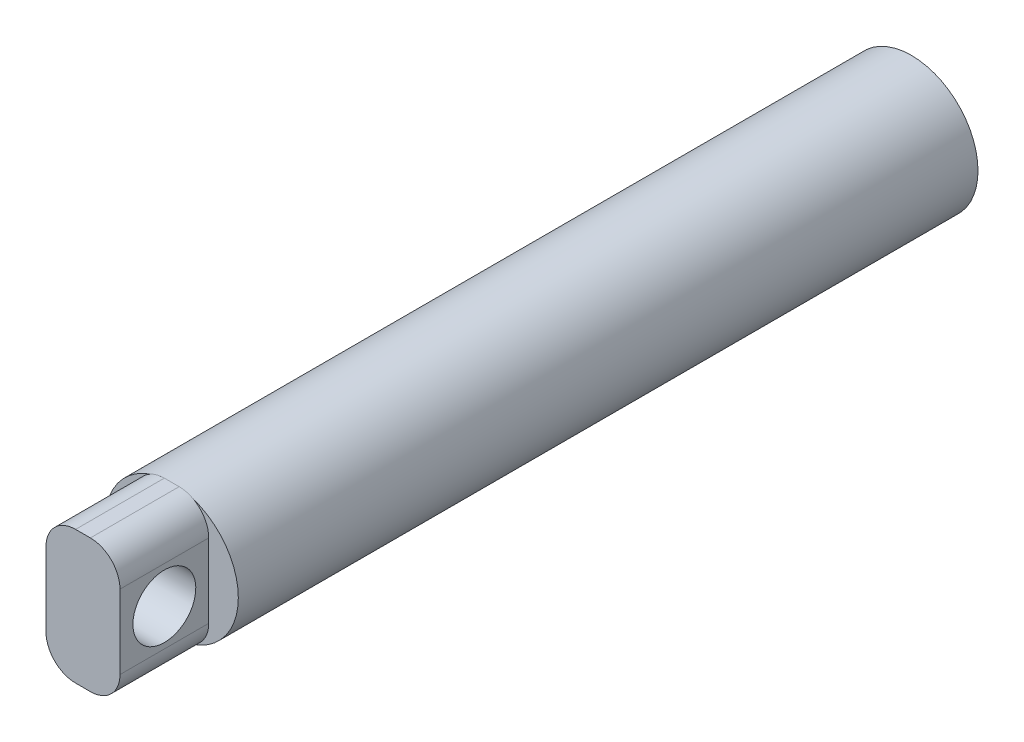
ISO-10303-21;
HEADER;
FILE_DESCRIPTION(('STEP AP214'),'2;1');
FILE_NAME('part.step','',(''),(''),'','','');
FILE_SCHEMA(('AUTOMOTIVE_DESIGN { 1 0 10303 214 1 1 1 1 }'));
ENDSEC;
DATA;
#1=APPLICATION_CONTEXT('core data for automotive mechanical design processes');
#2=APPLICATION_PROTOCOL_DEFINITION('international standard','automotive_design',2000,#1);
#3=PRODUCT_CONTEXT('',#1,'mechanical');
#4=PRODUCT('Part','Part','',(#3));
#5=PRODUCT_RELATED_PRODUCT_CATEGORY('part','',(#4));
#6=PRODUCT_DEFINITION_FORMATION('','',#4);
#7=PRODUCT_DEFINITION_CONTEXT('part definition',#1,'design');
#8=PRODUCT_DEFINITION('design','',#6,#7);
#9=PRODUCT_DEFINITION_SHAPE('','',#8);
#10=(LENGTH_UNIT() NAMED_UNIT(*) SI_UNIT(.MILLI.,.METRE.));
#11=(NAMED_UNIT(*) PLANE_ANGLE_UNIT() SI_UNIT($,.RADIAN.));
#12=(NAMED_UNIT(*) SI_UNIT($,.STERADIAN.) SOLID_ANGLE_UNIT());
#13=UNCERTAINTY_MEASURE_WITH_UNIT(LENGTH_MEASURE(1.E-05),#10,'distance_accuracy_value','');
#14=(GEOMETRIC_REPRESENTATION_CONTEXT(3) GLOBAL_UNCERTAINTY_ASSIGNED_CONTEXT((#13)) GLOBAL_UNIT_ASSIGNED_CONTEXT((#10,
#11,#12)) REPRESENTATION_CONTEXT('',''));
#15=CARTESIAN_POINT('',(0.,0.,0.));
#16=DIRECTION('',(0.,0.,1.));
#17=DIRECTION('',(1.,0.,0.));
#18=AXIS2_PLACEMENT_3D('',#15,#16,#17);
#19=CARTESIAN_POINT('',(0.,0.,50.));
#20=DIRECTION('',(0.,0.,1.));
#21=DIRECTION('',(1.,0.,0.));
#22=AXIS2_PLACEMENT_3D('',#19,#20,#21);
#23=PLANE('',#22);
#24=DIRECTION('',(0.,1.,0.));
#25=VECTOR('',#24,1.);
#26=CARTESIAN_POINT('',(2.5,-4.5,50.));
#27=LINE('',#26,#25);
#28=CARTESIAN_POINT('',(2.5,-2.5,50.));
#29=VERTEX_POINT('',#28);
#30=CARTESIAN_POINT('',(2.5,2.5,50.));
#31=VERTEX_POINT('',#30);
#32=EDGE_CURVE('E143',#29,#31,#27,.T.);
#33=ORIENTED_EDGE('',*,*,#32,.F.);
#34=CARTESIAN_POINT('',(0.5,-2.5,50.));
#35=DIRECTION('',(0.,0.,1.));
#36=DIRECTION('',(1.,0.,0.));
#37=AXIS2_PLACEMENT_3D('',#34,#35,#36);
#38=CIRCLE('',#37,2.);
#39=CARTESIAN_POINT('',(1.44991638187988,-4.26001672362402,50.));
#40=VERTEX_POINT('',#39);
#41=EDGE_CURVE('E110',#29,#40,#38,.F.);
#42=ORIENTED_EDGE('',*,*,#41,.T.);
#43=CARTESIAN_POINT('',(0.,0.,50.));
#44=DIRECTION('',(0.,0.,1.));
#45=DIRECTION('',(1.,0.,0.));
#46=AXIS2_PLACEMENT_3D('',#43,#44,#45);
#47=CIRCLE('',#46,4.5);
#48=CARTESIAN_POINT('',(1.44991638187988,4.26001672362402,50.));
#49=VERTEX_POINT('',#48);
#50=EDGE_CURVE('E61',#40,#49,#47,.T.);
#51=ORIENTED_EDGE('',*,*,#50,.T.);
#52=CARTESIAN_POINT('',(0.500000000000001,2.5,50.));
#53=DIRECTION('',(0.,0.,1.));
#54=DIRECTION('',(1.,0.,0.));
#55=AXIS2_PLACEMENT_3D('',#52,#53,#54);
#56=CIRCLE('',#55,2.);
#57=EDGE_CURVE('E46',#49,#31,#56,.F.);
#58=ORIENTED_EDGE('',*,*,#57,.T.);
#59=EDGE_LOOP('',(#33,#42,#51,#58));
#60=FACE_BOUND('',#59,.T.);
#61=ADVANCED_FACE('F38',(#60),#23,.T.);
#62=CARTESIAN_POINT('',(0.,0.,50.));
#63=DIRECTION('',(0.,0.,-1.));
#64=DIRECTION('',(-1.,0.,0.));
#65=AXIS2_PLACEMENT_3D('',#62,#63,#64);
#66=CYLINDRICAL_SURFACE('',#65,4.5);
#67=CARTESIAN_POINT('',(0.,4.5,50.));
#68=VERTEX_POINT('',#67);
#69=EDGE_CURVE('E193',#49,#68,#47,.T.);
#70=ORIENTED_EDGE('',*,*,#69,.F.);
#71=ORIENTED_EDGE('',*,*,#50,.F.);
#72=CARTESIAN_POINT('',(0.,-4.5,50.));
#73=VERTEX_POINT('',#72);
#74=EDGE_CURVE('E243',#73,#40,#47,.T.);
#75=ORIENTED_EDGE('',*,*,#74,.F.);
#76=CARTESIAN_POINT('',(-1.44991638187988,-4.26001672362402,50.));
#77=VERTEX_POINT('',#76);
#78=EDGE_CURVE('E196',#77,#73,#47,.T.);
#79=ORIENTED_EDGE('',*,*,#78,.F.);
#80=CARTESIAN_POINT('',(-1.44991638187988,4.26001672362402,50.));
#81=VERTEX_POINT('',#80);
#82=EDGE_CURVE('E53',#81,#77,#47,.T.);
#83=ORIENTED_EDGE('',*,*,#82,.F.);
#84=EDGE_CURVE('E107',#68,#81,#47,.T.);
#85=ORIENTED_EDGE('',*,*,#84,.F.);
#86=EDGE_LOOP('',(#70,#71,#75,#79,#83,#85));
#87=FACE_BOUND('',#86,.T.);
#88=CARTESIAN_POINT('',(0.,0.,0.));
#89=DIRECTION('',(0.,0.,1.));
#90=DIRECTION('',(1.,0.,0.));
#91=AXIS2_PLACEMENT_3D('',#88,#89,#90);
#92=CIRCLE('',#91,4.5);
#93=CARTESIAN_POINT('',(4.5,0.,0.));
#94=VERTEX_POINT('',#93);
#95=EDGE_CURVE('E167',#94,#94,#92,.T.);
#96=ORIENTED_EDGE('',*,*,#95,.T.);
#97=EDGE_LOOP('',(#96));
#98=FACE_BOUND('',#97,.T.);
#99=ADVANCED_FACE('F248',(#87,#98),#66,.T.);
#100=DIRECTION('',(0.,-1.,0.));
#101=VECTOR('',#100,1.);
#102=CARTESIAN_POINT('',(-2.5,-4.5,50.));
#103=LINE('',#102,#101);
#104=CARTESIAN_POINT('',(-2.5,2.5,50.));
#105=VERTEX_POINT('',#104);
#106=CARTESIAN_POINT('',(-2.5,-2.5,50.));
#107=VERTEX_POINT('',#106);
#108=EDGE_CURVE('E157',#105,#107,#103,.T.);
#109=ORIENTED_EDGE('',*,*,#108,.F.);
#110=CARTESIAN_POINT('',(-0.5,2.5,50.));
#111=DIRECTION('',(0.,0.,1.));
#112=DIRECTION('',(1.,0.,0.));
#113=AXIS2_PLACEMENT_3D('',#110,#111,#112);
#114=CIRCLE('',#113,2.);
#115=EDGE_CURVE('E11',#105,#81,#114,.F.);
#116=ORIENTED_EDGE('',*,*,#115,.T.);
#117=ORIENTED_EDGE('',*,*,#82,.T.);
#118=CARTESIAN_POINT('',(-0.500000000000001,-2.5,50.));
#119=DIRECTION('',(0.,0.,1.));
#120=DIRECTION('',(1.,0.,0.));
#121=AXIS2_PLACEMENT_3D('',#118,#119,#120);
#122=CIRCLE('',#121,2.);
#123=EDGE_CURVE('E136',#77,#107,#122,.F.);
#124=ORIENTED_EDGE('',*,*,#123,.T.);
#125=EDGE_LOOP('',(#109,#116,#117,#124));
#126=FACE_BOUND('',#125,.T.);
#127=ADVANCED_FACE('F191',(#126),#23,.T.);
#128=CARTESIAN_POINT('',(0.,0.,0.));
#129=DIRECTION('',(0.,0.,1.));
#130=DIRECTION('',(1.,0.,0.));
#131=AXIS2_PLACEMENT_3D('',#128,#129,#130);
#132=PLANE('',#131);
#133=ORIENTED_EDGE('',*,*,#95,.F.);
#134=EDGE_LOOP('',(#133));
#135=FACE_BOUND('',#134,.T.);
#136=ADVANCED_FACE('F270',(#135),#132,.F.);
#137=CARTESIAN_POINT('',(0.,0.,50.));
#138=DIRECTION('',(0.,0.,-1.));
#139=DIRECTION('',(-1.,0.,0.));
#140=AXIS2_PLACEMENT_3D('',#137,#138,#139);
#141=PLANE('',#140);
#142=DIRECTION('',(-1.,0.,0.));
#143=VECTOR('',#142,1.);
#144=CARTESIAN_POINT('',(-2.5,4.5,50.));
#145=LINE('',#144,#143);
#146=CARTESIAN_POINT('',(0.500000000000001,4.5,50.));
#147=VERTEX_POINT('',#146);
#148=EDGE_CURVE('E120',#147,#68,#145,.T.);
#149=ORIENTED_EDGE('',*,*,#148,.F.);
#150=CARTESIAN_POINT('',(0.500000000000001,2.5,50.));
#151=DIRECTION('',(0.,0.,-1.));
#152=DIRECTION('',(-1.,0.,0.));
#153=AXIS2_PLACEMENT_3D('',#150,#151,#152);
#154=CIRCLE('',#153,2.);
#155=EDGE_CURVE('E96',#147,#49,#154,.T.);
#156=ORIENTED_EDGE('',*,*,#155,.T.);
#157=ORIENTED_EDGE('',*,*,#69,.T.);
#158=EDGE_LOOP('',(#149,#156,#157));
#159=FACE_BOUND('',#158,.T.);
#160=ADVANCED_FACE('F274',(#159),#141,.T.);
#161=ORIENTED_EDGE('',*,*,#84,.T.);
#162=CARTESIAN_POINT('',(-0.5,2.5,50.));
#163=DIRECTION('',(0.,0.,-1.));
#164=DIRECTION('',(-1.,0.,0.));
#165=AXIS2_PLACEMENT_3D('',#162,#163,#164);
#166=CIRCLE('',#165,2.);
#167=CARTESIAN_POINT('',(-0.5,4.5,50.));
#168=VERTEX_POINT('',#167);
#169=EDGE_CURVE('E102',#81,#168,#166,.T.);
#170=ORIENTED_EDGE('',*,*,#169,.T.);
#171=EDGE_CURVE('E106',#68,#168,#145,.T.);
#172=ORIENTED_EDGE('',*,*,#171,.F.);
#173=EDGE_LOOP('',(#161,#170,#172));
#174=FACE_BOUND('',#173,.T.);
#175=ADVANCED_FACE('F104',(#174),#141,.T.);
#176=DIRECTION('',(1.,0.,0.));
#177=VECTOR('',#176,1.);
#178=CARTESIAN_POINT('',(-2.5,-4.5,50.));
#179=LINE('',#178,#177);
#180=CARTESIAN_POINT('',(-0.500000000000001,-4.5,50.));
#181=VERTEX_POINT('',#180);
#182=EDGE_CURVE('E198',#181,#73,#179,.T.);
#183=ORIENTED_EDGE('',*,*,#182,.F.);
#184=CARTESIAN_POINT('',(-0.500000000000001,-2.5,50.));
#185=DIRECTION('',(0.,0.,-1.));
#186=DIRECTION('',(-1.,0.,0.));
#187=AXIS2_PLACEMENT_3D('',#184,#185,#186);
#188=CIRCLE('',#187,2.);
#189=EDGE_CURVE('E186',#181,#77,#188,.T.);
#190=ORIENTED_EDGE('',*,*,#189,.T.);
#191=ORIENTED_EDGE('',*,*,#78,.T.);
#192=EDGE_LOOP('',(#183,#190,#191));
#193=FACE_BOUND('',#192,.T.);
#194=ADVANCED_FACE('F246',(#193),#141,.T.);
#195=CARTESIAN_POINT('',(2.5,-4.5,56.));
#196=DIRECTION('',(-1.,0.,0.));
#197=DIRECTION('',(0.,-1.,0.));
#198=AXIS2_PLACEMENT_3D('',#195,#196,#197);
#199=PLANE('',#198);
#200=CARTESIAN_POINT('',(2.5,0.,53.));
#201=DIRECTION('',(-1.,0.,0.));
#202=DIRECTION('',(0.,-1.,0.));
#203=AXIS2_PLACEMENT_3D('',#200,#201,#202);
#204=CIRCLE('',#203,2.125);
#205=CARTESIAN_POINT('',(2.5,-2.125,53.));
#206=VERTEX_POINT('',#205);
#207=EDGE_CURVE('E121',#206,#206,#204,.T.);
#208=ORIENTED_EDGE('',*,*,#207,.T.);
#209=EDGE_LOOP('',(#208));
#210=FACE_BOUND('',#209,.T.);
#211=DIRECTION('',(0.,1.,0.));
#212=VECTOR('',#211,1.);
#213=CARTESIAN_POINT('',(2.5,-4.5,56.));
#214=LINE('',#213,#212);
#215=CARTESIAN_POINT('',(2.5,-2.5,56.));
#216=VERTEX_POINT('',#215);
#217=CARTESIAN_POINT('',(2.5,2.5,56.));
#218=VERTEX_POINT('',#217);
#219=EDGE_CURVE('E200',#216,#218,#214,.T.);
#220=ORIENTED_EDGE('',*,*,#219,.F.);
#221=DIRECTION('',(0.,0.,-1.));
#222=VECTOR('',#221,1.);
#223=CARTESIAN_POINT('',(2.5,-2.5,56.));
#224=LINE('',#223,#222);
#225=EDGE_CURVE('E156',#216,#29,#224,.T.);
#226=ORIENTED_EDGE('',*,*,#225,.T.);
#227=ORIENTED_EDGE('',*,*,#32,.T.);
#228=DIRECTION('',(0.,0.,-1.));
#229=VECTOR('',#228,1.);
#230=CARTESIAN_POINT('',(2.5,2.5,56.));
#231=LINE('',#230,#229);
#232=EDGE_CURVE('E153',#31,#218,#231,.F.);
#233=ORIENTED_EDGE('',*,*,#232,.T.);
#234=EDGE_LOOP('',(#220,#226,#227,#233));
#235=FACE_BOUND('',#234,.T.);
#236=ADVANCED_FACE('F151',(#210,#235),#199,.F.);
#237=CARTESIAN_POINT('',(-2.5,4.5,56.));
#238=DIRECTION('',(0.,-1.,0.));
#239=DIRECTION('',(0.,0.,-1.));
#240=AXIS2_PLACEMENT_3D('',#237,#238,#239);
#241=PLANE('',#240);
#242=DIRECTION('',(-1.,0.,0.));
#243=VECTOR('',#242,1.);
#244=CARTESIAN_POINT('',(-2.5,4.5,56.));
#245=LINE('',#244,#243);
#246=CARTESIAN_POINT('',(0.500000000000001,4.5,56.));
#247=VERTEX_POINT('',#246);
#248=CARTESIAN_POINT('',(-0.5,4.5,56.));
#249=VERTEX_POINT('',#248);
#250=EDGE_CURVE('E206',#247,#249,#245,.T.);
#251=ORIENTED_EDGE('',*,*,#250,.F.);
#252=DIRECTION('',(0.,0.,-1.));
#253=VECTOR('',#252,1.);
#254=CARTESIAN_POINT('',(0.500000000000001,4.5,56.));
#255=LINE('',#254,#253);
#256=EDGE_CURVE('E126',#247,#147,#255,.T.);
#257=ORIENTED_EDGE('',*,*,#256,.T.);
#258=ORIENTED_EDGE('',*,*,#148,.T.);
#259=ORIENTED_EDGE('',*,*,#171,.T.);
#260=DIRECTION('',(0.,0.,-1.));
#261=VECTOR('',#260,1.);
#262=CARTESIAN_POINT('',(-0.5,4.5,56.));
#263=LINE('',#262,#261);
#264=EDGE_CURVE('E117',#168,#249,#263,.F.);
#265=ORIENTED_EDGE('',*,*,#264,.T.);
#266=EDGE_LOOP('',(#251,#257,#258,#259,#265));
#267=FACE_BOUND('',#266,.T.);
#268=ADVANCED_FACE('F116',(#267),#241,.F.);
#269=CARTESIAN_POINT('',(-2.5,-4.5,56.));
#270=DIRECTION('',(1.,0.,0.));
#271=DIRECTION('',(0.,1.,0.));
#272=AXIS2_PLACEMENT_3D('',#269,#270,#271);
#273=PLANE('',#272);
#274=CARTESIAN_POINT('',(-2.5,0.,53.));
#275=DIRECTION('',(-1.,0.,0.));
#276=DIRECTION('',(0.,-1.,0.));
#277=AXIS2_PLACEMENT_3D('',#274,#275,#276);
#278=CIRCLE('',#277,2.125);
#279=CARTESIAN_POINT('',(-2.5,-2.125,53.));
#280=VERTEX_POINT('',#279);
#281=EDGE_CURVE('E367',#280,#280,#278,.T.);
#282=ORIENTED_EDGE('',*,*,#281,.F.);
#283=EDGE_LOOP('',(#282));
#284=FACE_BOUND('',#283,.T.);
#285=ORIENTED_EDGE('',*,*,#108,.T.);
#286=DIRECTION('',(0.,0.,-1.));
#287=VECTOR('',#286,1.);
#288=CARTESIAN_POINT('',(-2.5,-2.5,56.));
#289=LINE('',#288,#287);
#290=CARTESIAN_POINT('',(-2.5,-2.5,56.));
#291=VERTEX_POINT('',#290);
#292=EDGE_CURVE('E83',#107,#291,#289,.F.);
#293=ORIENTED_EDGE('',*,*,#292,.T.);
#294=DIRECTION('',(0.,-1.,0.));
#295=VECTOR('',#294,1.);
#296=CARTESIAN_POINT('',(-2.5,-4.5,56.));
#297=LINE('',#296,#295);
#298=CARTESIAN_POINT('',(-2.5,2.5,56.));
#299=VERTEX_POINT('',#298);
#300=EDGE_CURVE('E190',#299,#291,#297,.T.);
#301=ORIENTED_EDGE('',*,*,#300,.F.);
#302=DIRECTION('',(0.,0.,-1.));
#303=VECTOR('',#302,1.);
#304=CARTESIAN_POINT('',(-2.5,2.5,56.));
#305=LINE('',#304,#303);
#306=EDGE_CURVE('E129',#299,#105,#305,.T.);
#307=ORIENTED_EDGE('',*,*,#306,.T.);
#308=EDGE_LOOP('',(#285,#293,#301,#307));
#309=FACE_BOUND('',#308,.T.);
#310=ADVANCED_FACE('F189',(#284,#309),#273,.F.);
#311=CARTESIAN_POINT('',(-2.5,-4.5,56.));
#312=DIRECTION('',(0.,1.,0.));
#313=DIRECTION('',(0.,0.,1.));
#314=AXIS2_PLACEMENT_3D('',#311,#312,#313);
#315=PLANE('',#314);
#316=CARTESIAN_POINT('',(0.5,-4.5,50.));
#317=VERTEX_POINT('',#316);
#318=EDGE_CURVE('E201',#73,#317,#179,.T.);
#319=ORIENTED_EDGE('',*,*,#318,.T.);
#320=DIRECTION('',(0.,0.,-1.));
#321=VECTOR('',#320,1.);
#322=CARTESIAN_POINT('',(0.5,-4.5,56.));
#323=LINE('',#322,#321);
#324=CARTESIAN_POINT('',(0.5,-4.5,56.));
#325=VERTEX_POINT('',#324);
#326=EDGE_CURVE('E175',#317,#325,#323,.F.);
#327=ORIENTED_EDGE('',*,*,#326,.T.);
#328=DIRECTION('',(1.,0.,0.));
#329=VECTOR('',#328,1.);
#330=CARTESIAN_POINT('',(-2.5,-4.5,56.));
#331=LINE('',#330,#329);
#332=CARTESIAN_POINT('',(-0.500000000000001,-4.5,56.));
#333=VERTEX_POINT('',#332);
#334=EDGE_CURVE('E228',#333,#325,#331,.T.);
#335=ORIENTED_EDGE('',*,*,#334,.F.);
#336=DIRECTION('',(0.,0.,-1.));
#337=VECTOR('',#336,1.);
#338=CARTESIAN_POINT('',(-0.500000000000001,-4.5,56.));
#339=LINE('',#338,#337);
#340=EDGE_CURVE('E172',#333,#181,#339,.T.);
#341=ORIENTED_EDGE('',*,*,#340,.T.);
#342=ORIENTED_EDGE('',*,*,#182,.T.);
#343=EDGE_LOOP('',(#319,#327,#335,#341,#342));
#344=FACE_BOUND('',#343,.T.);
#345=ADVANCED_FACE('F211',(#344),#315,.F.);
#346=CARTESIAN_POINT('',(0.,0.,56.));
#347=DIRECTION('',(0.,0.,-1.));
#348=DIRECTION('',(-1.,0.,0.));
#349=AXIS2_PLACEMENT_3D('',#346,#347,#348);
#350=PLANE('',#349);
#351=ORIENTED_EDGE('',*,*,#334,.T.);
#352=CARTESIAN_POINT('',(0.5,-2.5,56.));
#353=DIRECTION('',(0.,0.,-1.));
#354=DIRECTION('',(-1.,0.,0.));
#355=AXIS2_PLACEMENT_3D('',#352,#353,#354);
#356=CIRCLE('',#355,2.);
#357=EDGE_CURVE('E183',#325,#216,#356,.F.);
#358=ORIENTED_EDGE('',*,*,#357,.T.);
#359=ORIENTED_EDGE('',*,*,#219,.T.);
#360=CARTESIAN_POINT('',(0.500000000000001,2.5,56.));
#361=DIRECTION('',(0.,0.,-1.));
#362=DIRECTION('',(-1.,0.,0.));
#363=AXIS2_PLACEMENT_3D('',#360,#361,#362);
#364=CIRCLE('',#363,2.);
#365=EDGE_CURVE('E162',#218,#247,#364,.F.);
#366=ORIENTED_EDGE('',*,*,#365,.T.);
#367=ORIENTED_EDGE('',*,*,#250,.T.);
#368=CARTESIAN_POINT('',(-0.5,2.5,56.));
#369=DIRECTION('',(0.,0.,-1.));
#370=DIRECTION('',(-1.,0.,0.));
#371=AXIS2_PLACEMENT_3D('',#368,#369,#370);
#372=CIRCLE('',#371,2.);
#373=EDGE_CURVE('E125',#249,#299,#372,.F.);
#374=ORIENTED_EDGE('',*,*,#373,.T.);
#375=ORIENTED_EDGE('',*,*,#300,.T.);
#376=CARTESIAN_POINT('',(-0.500000000000001,-2.5,56.));
#377=DIRECTION('',(0.,0.,-1.));
#378=DIRECTION('',(-1.,0.,0.));
#379=AXIS2_PLACEMENT_3D('',#376,#377,#378);
#380=CIRCLE('',#379,2.);
#381=EDGE_CURVE('E180',#291,#333,#380,.F.);
#382=ORIENTED_EDGE('',*,*,#381,.T.);
#383=EDGE_LOOP('',(#351,#358,#359,#366,#367,#374,#375,#382));
#384=FACE_BOUND('',#383,.T.);
#385=ADVANCED_FACE('F227',(#384),#350,.F.);
#386=ORIENTED_EDGE('',*,*,#74,.T.);
#387=CARTESIAN_POINT('',(0.5,-2.5,50.));
#388=DIRECTION('',(0.,0.,-1.));
#389=DIRECTION('',(-1.,0.,0.));
#390=AXIS2_PLACEMENT_3D('',#387,#388,#389);
#391=CIRCLE('',#390,2.);
#392=EDGE_CURVE('E164',#40,#317,#391,.T.);
#393=ORIENTED_EDGE('',*,*,#392,.T.);
#394=ORIENTED_EDGE('',*,*,#318,.F.);
#395=EDGE_LOOP('',(#386,#393,#394));
#396=FACE_BOUND('',#395,.T.);
#397=ADVANCED_FACE('F259',(#396),#141,.T.);
#398=CARTESIAN_POINT('',(0.5,-2.5,56.));
#399=DIRECTION('',(0.,0.,-1.));
#400=DIRECTION('',(-1.,0.,0.));
#401=AXIS2_PLACEMENT_3D('',#398,#399,#400);
#402=CYLINDRICAL_SURFACE('',#401,2.);
#403=ORIENTED_EDGE('',*,*,#357,.F.);
#404=ORIENTED_EDGE('',*,*,#326,.F.);
#405=ORIENTED_EDGE('',*,*,#392,.F.);
#406=ORIENTED_EDGE('',*,*,#41,.F.);
#407=ORIENTED_EDGE('',*,*,#225,.F.);
#408=EDGE_LOOP('',(#403,#404,#405,#406,#407));
#409=FACE_BOUND('',#408,.T.);
#410=ADVANCED_FACE('F221',(#409),#402,.T.);
#411=CARTESIAN_POINT('',(-0.500000000000001,-2.5,56.));
#412=DIRECTION('',(0.,0.,-1.));
#413=DIRECTION('',(-1.,0.,0.));
#414=AXIS2_PLACEMENT_3D('',#411,#412,#413);
#415=CYLINDRICAL_SURFACE('',#414,2.);
#416=ORIENTED_EDGE('',*,*,#381,.F.);
#417=ORIENTED_EDGE('',*,*,#292,.F.);
#418=ORIENTED_EDGE('',*,*,#123,.F.);
#419=ORIENTED_EDGE('',*,*,#189,.F.);
#420=ORIENTED_EDGE('',*,*,#340,.F.);
#421=EDGE_LOOP('',(#416,#417,#418,#419,#420));
#422=FACE_BOUND('',#421,.T.);
#423=ADVANCED_FACE('F251',(#422),#415,.T.);
#424=CARTESIAN_POINT('',(0.500000000000001,2.5,56.));
#425=DIRECTION('',(0.,0.,-1.));
#426=DIRECTION('',(-1.,0.,0.));
#427=AXIS2_PLACEMENT_3D('',#424,#425,#426);
#428=CYLINDRICAL_SURFACE('',#427,2.);
#429=ORIENTED_EDGE('',*,*,#365,.F.);
#430=ORIENTED_EDGE('',*,*,#232,.F.);
#431=ORIENTED_EDGE('',*,*,#57,.F.);
#432=ORIENTED_EDGE('',*,*,#155,.F.);
#433=ORIENTED_EDGE('',*,*,#256,.F.);
#434=EDGE_LOOP('',(#429,#430,#431,#432,#433));
#435=FACE_BOUND('',#434,.T.);
#436=ADVANCED_FACE('F160',(#435),#428,.T.);
#437=CARTESIAN_POINT('',(-0.5,2.5,56.));
#438=DIRECTION('',(0.,0.,-1.));
#439=DIRECTION('',(-1.,0.,0.));
#440=AXIS2_PLACEMENT_3D('',#437,#438,#439);
#441=CYLINDRICAL_SURFACE('',#440,2.);
#442=ORIENTED_EDGE('',*,*,#373,.F.);
#443=ORIENTED_EDGE('',*,*,#264,.F.);
#444=ORIENTED_EDGE('',*,*,#169,.F.);
#445=ORIENTED_EDGE('',*,*,#115,.F.);
#446=ORIENTED_EDGE('',*,*,#306,.F.);
#447=EDGE_LOOP('',(#442,#443,#444,#445,#446));
#448=FACE_BOUND('',#447,.T.);
#449=ADVANCED_FACE('F40',(#448),#441,.T.);
#450=CARTESIAN_POINT('',(3.5,0.,53.));
#451=DIRECTION('',(-1.,0.,0.));
#452=DIRECTION('',(0.,-1.,0.));
#453=AXIS2_PLACEMENT_3D('',#450,#451,#452);
#454=CYLINDRICAL_SURFACE('',#453,2.125);
#455=ORIENTED_EDGE('',*,*,#281,.T.);
#456=EDGE_LOOP('',(#455));
#457=FACE_BOUND('',#456,.T.);
#458=ORIENTED_EDGE('',*,*,#207,.F.);
#459=EDGE_LOOP('',(#458));
#460=FACE_BOUND('',#459,.T.);
#461=ADVANCED_FACE('F341',(#457,#460),#454,.F.);
#462=CLOSED_SHELL('',(#61,#99,#127,#136,#160,#175,#194,#236,#268,#310,#345,#385,#397,#410,#423,
#436,#449,#461));
#463=MANIFOLD_SOLID_BREP('B2',#462);
#464=ADVANCED_BREP_SHAPE_REPRESENTATION('',(#18,#463),#14);
#465=SHAPE_DEFINITION_REPRESENTATION(#9,#464);
ENDSEC;
END-ISO-10303-21;
